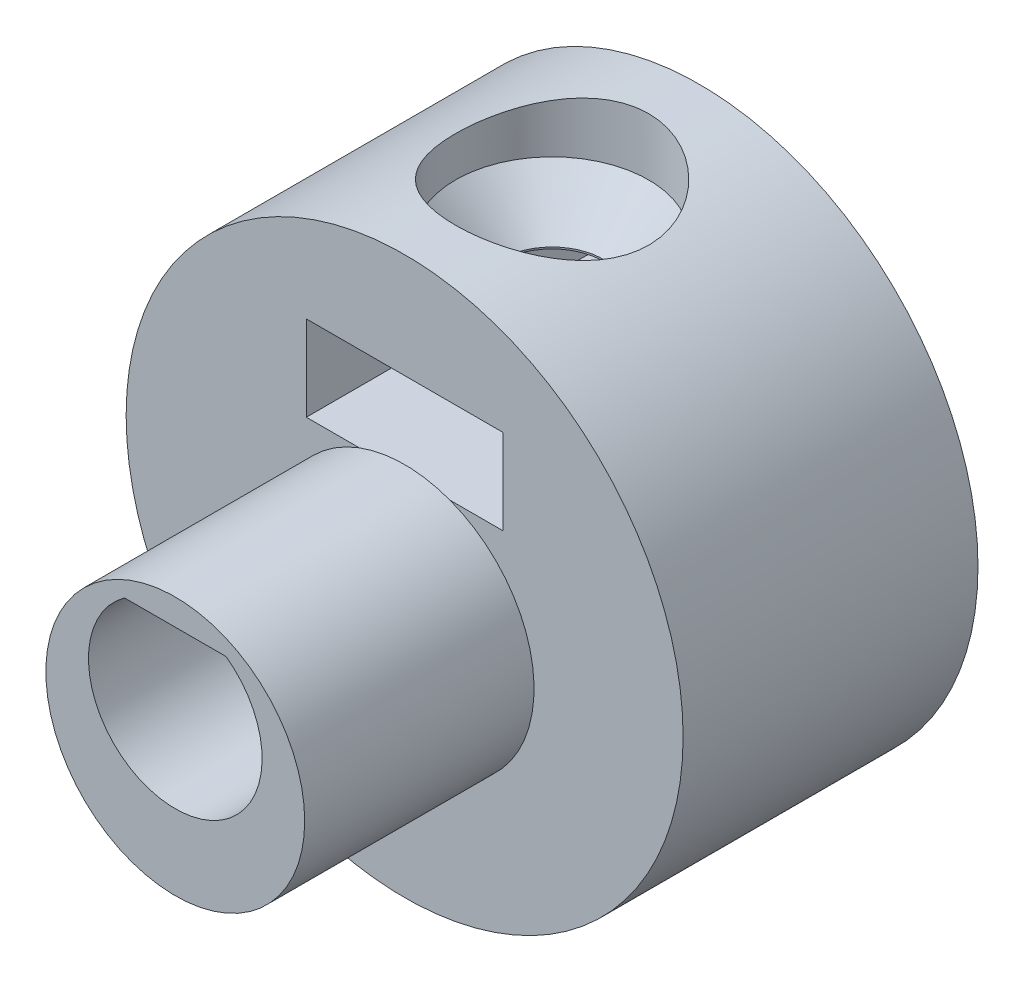
ISO-10303-21;
HEADER;
FILE_DESCRIPTION(('STEP AP214'),'2;1');
FILE_NAME('part.step','',(''),(''),'','','');
FILE_SCHEMA(('AUTOMOTIVE_DESIGN { 1 0 10303 214 1 1 1 1 }'));
ENDSEC;
DATA;
#1=APPLICATION_CONTEXT('core data for automotive mechanical design processes');
#2=APPLICATION_PROTOCOL_DEFINITION('international standard','automotive_design',2000,#1);
#3=PRODUCT_CONTEXT('',#1,'mechanical');
#4=PRODUCT('Part','Part','',(#3));
#5=PRODUCT_RELATED_PRODUCT_CATEGORY('part','',(#4));
#6=PRODUCT_DEFINITION_FORMATION('','',#4);
#7=PRODUCT_DEFINITION_CONTEXT('part definition',#1,'design');
#8=PRODUCT_DEFINITION('design','',#6,#7);
#9=PRODUCT_DEFINITION_SHAPE('','',#8);
#10=(LENGTH_UNIT() NAMED_UNIT(*) SI_UNIT(.MILLI.,.METRE.));
#11=(NAMED_UNIT(*) PLANE_ANGLE_UNIT() SI_UNIT($,.RADIAN.));
#12=(NAMED_UNIT(*) SI_UNIT($,.STERADIAN.) SOLID_ANGLE_UNIT());
#13=UNCERTAINTY_MEASURE_WITH_UNIT(LENGTH_MEASURE(1.E-05),#10,'distance_accuracy_value','');
#14=(GEOMETRIC_REPRESENTATION_CONTEXT(3) GLOBAL_UNCERTAINTY_ASSIGNED_CONTEXT((#13)) GLOBAL_UNIT_ASSIGNED_CONTEXT((#10,
#11,#12)) REPRESENTATION_CONTEXT('',''));
#15=CARTESIAN_POINT('',(0.,0.,0.));
#16=DIRECTION('',(0.,0.,1.));
#17=DIRECTION('',(1.,0.,0.));
#18=AXIS2_PLACEMENT_3D('',#15,#16,#17);
#19=CARTESIAN_POINT('',(0.,0.,9.));
#20=DIRECTION('',(0.,0.,-1.));
#21=DIRECTION('',(-1.,0.,0.));
#22=AXIS2_PLACEMENT_3D('',#19,#20,#21);
#23=CYLINDRICAL_SURFACE('',#22,8.5);
#24=CARTESIAN_POINT('',(0.,0.,9.));
#25=DIRECTION('',(0.,0.,1.));
#26=DIRECTION('',(1.,0.,0.));
#27=AXIS2_PLACEMENT_3D('',#24,#25,#26);
#28=CIRCLE('',#27,8.5);
#29=CARTESIAN_POINT('',(8.5,0.,9.));
#30=VERTEX_POINT('',#29);
#31=EDGE_CURVE('E272',#30,#30,#28,.T.);
#32=ORIENTED_EDGE('',*,*,#31,.F.);
#33=EDGE_LOOP('',(#32));
#34=FACE_BOUND('',#33,.T.);
#35=CARTESIAN_POINT('',(0.,0.,0.));
#36=DIRECTION('',(0.,0.,1.));
#37=DIRECTION('',(1.,0.,0.));
#38=AXIS2_PLACEMENT_3D('',#35,#36,#37);
#39=CIRCLE('',#38,8.5);
#40=CARTESIAN_POINT('',(8.5,0.,0.));
#41=VERTEX_POINT('',#40);
#42=EDGE_CURVE('E266',#41,#41,#39,.T.);
#43=ORIENTED_EDGE('',*,*,#42,.T.);
#44=EDGE_LOOP('',(#43));
#45=FACE_BOUND('',#44,.T.);
#46=CARTESIAN_POINT('',(-2.4976566133076,8.12475916209218,6.06978069869673));
#47=CARTESIAN_POINT('',(-2.45319115247166,8.13842624372445,6.14052214784692));
#48=CARTESIAN_POINT('',(-2.40579379129014,8.15259906685285,6.20926792787036));
#49=CARTESIAN_POINT('',(-2.30541918353997,8.18155142551015,6.34241791198123));
#50=CARTESIAN_POINT('',(-2.25244214730842,8.19633093815584,6.40682227957694));
#51=CARTESIAN_POINT('',(-2.08559993364935,8.24096387551114,6.59296340845329));
#52=CARTESIAN_POINT('',(-1.96379293821466,8.27112157248585,6.70767691704536));
#53=CARTESIAN_POINT('',(-1.70636003995567,8.32797463190604,6.91184711282402));
#54=CARTESIAN_POINT('',(-1.57128592838729,8.35474881482083,7.001981892767));
#55=CARTESIAN_POINT('',(-1.28750137103305,8.40315485018163,7.15915511575892));
#56=CARTESIAN_POINT('',(-1.13879895604352,8.42478970443847,7.22620705151039));
#57=CARTESIAN_POINT('',(-0.831187937836323,8.46068191069057,7.33519131239508));
#58=CARTESIAN_POINT('',(-0.672256571938539,8.47492212101672,7.37706530718806));
#59=CARTESIAN_POINT('',(-0.349104402202426,8.4943684291606,7.43385731899328));
#60=CARTESIAN_POINT('',(-0.184884583871303,8.49957620037078,7.44878032909372));
#61=CARTESIAN_POINT('',(0.138015723993133,8.50036011208845,7.45103621336103));
#62=CARTESIAN_POINT('',(0.296689734672785,8.4962657088658,7.43931282000832));
#63=CARTESIAN_POINT('',(0.609739891194811,8.47955195455849,7.39064304040091));
#64=CARTESIAN_POINT('',(0.764113634581695,8.46692793384153,7.35368283786199));
#65=CARTESIAN_POINT('',(1.06375533887611,8.4345186012922,7.25603150933245));
#66=CARTESIAN_POINT('',(1.20905000683216,8.41475557760322,7.19541419459285));
#67=CARTESIAN_POINT('',(1.48731375058839,8.37004774740902,7.0524065686952));
#68=CARTESIAN_POINT('',(1.62030956781964,8.34511458458429,6.97006507104002));
#69=CARTESIAN_POINT('',(1.77519124725063,8.31261821534849,6.85638504059988));
#70=CARTESIAN_POINT('',(1.8043222672237,8.30634083738567,6.83415379011479));
#71=CARTESIAN_POINT('',(1.96343933734412,8.27119610111673,6.70795471337644));
#72=CARTESIAN_POINT('',(2.08511950406867,8.24108270241644,6.59342954668651));
#73=CARTESIAN_POINT('',(2.30774596317545,8.1815459992705,6.34519120906915));
#74=CARTESIAN_POINT('',(2.40863639693148,8.15212473740542,6.2114279425932));
#75=CARTESIAN_POINT('',(2.58236776313032,8.09871823066431,5.93498995802956));
#76=CARTESIAN_POINT('',(2.65633004978303,8.07453878944837,5.79306002253414));
#77=CARTESIAN_POINT('',(2.7805092495441,8.03262664641585,5.49839769507062));
#78=CARTESIAN_POINT('',(2.83074936112863,8.01488765027596,5.34567602537025));
#79=CARTESIAN_POINT('',(2.90591996981457,7.98794413403531,5.03295557266693));
#80=CARTESIAN_POINT('',(2.9307875433104,7.97876083684202,4.87293972081594));
#81=CARTESIAN_POINT('',(2.95398174635075,7.97020434608399,4.55072336269741));
#82=CARTESIAN_POINT('',(2.95230970967962,7.97083065952385,4.38852296662646));
#83=CARTESIAN_POINT('',(2.92298994582522,7.98162544091318,4.07214390352963));
#84=CARTESIAN_POINT('',(2.89618320404268,7.9914849607523,3.91787537801917));
#85=CARTESIAN_POINT('',(2.81878881465332,8.01910824594589,3.61614548479724));
#86=CARTESIAN_POINT('',(2.76819372913322,8.03687448340477,3.46868626200185));
#87=CARTESIAN_POINT('',(2.64374182838853,8.07867559451911,3.18164089371048));
#88=CARTESIAN_POINT('',(2.56947203344734,8.10282034535183,3.04225083932772));
#89=CARTESIAN_POINT('',(2.4000811737298,8.15459461002143,2.77756977114323));
#90=CARTESIAN_POINT('',(2.30497218991926,8.18222210090779,2.65227065192168));
#91=CARTESIAN_POINT('',(2.14444672038787,8.22525010429297,2.47244158886466));
#92=CARTESIAN_POINT('',(2.08555070125962,8.24041673348502,2.41191270278541));
#93=CARTESIAN_POINT('',(1.96287977928872,8.27049513310864,2.29621000389169));
#94=CARTESIAN_POINT('',(1.89911464567286,8.28540734404793,2.24102594733433));
#95=CARTESIAN_POINT('',(1.83303027798234,8.3,2.18861513373476));
#96=B_SPLINE_CURVE_WITH_KNOTS('',3,(#46,#47,#48,#49,#50,#51,#52,#53,#54,#55,#56,#57,#58,#59,#60,
#61,#62,#63,#64,#65,#66,#67,#68,#69,#70,#71,#72,#73,#74,#75,#76,#77,#78,#79,#80,#81,#82,#83,#84,
#85,#86,#87,#88,#89,#90,#91,#92,#93,#94,#95),.UNSPECIFIED.,.F.,.F.,(4,2,2,2,2,2,2,2,2,2,2,2,2,2,
2,2,2,2,2,2,2,2,2,2,4),(0.,0.253833285787018,0.507657006239854,1.01513132403204,
1.50672343842426,1.99802771074242,2.49046585733757,2.98281276276087,3.4579950628208,
3.93343771763219,4.40740867898812,4.88032358222269,4.99186106409764,5.49853142231878,
6.00654586378571,6.48996962093975,6.9729196424049,7.45706448441352,7.94118499513888,
8.40966421544493,8.87829001289202,9.35558437726861,9.83260277159268,10.0897481621581,
10.3463905361852),.UNSPECIFIED.);
#97=CARTESIAN_POINT('',(-1.83303027798234,8.3,6.81138486626524));
#98=VERTEX_POINT('',#97);
#99=CARTESIAN_POINT('',(1.83303027798234,8.3,2.18861513373476));
#100=VERTEX_POINT('',#99);
#101=EDGE_CURVE('E187',#98,#100,#96,.T.);
#102=ORIENTED_EDGE('',*,*,#101,.F.);
#103=CARTESIAN_POINT('',(2.4976566133076,8.12475916209218,2.93021930130327));
#104=CARTESIAN_POINT('',(2.45318994500136,8.13842662563914,2.85947588226206));
#105=CARTESIAN_POINT('',(2.40579116119691,8.15259985847907,2.79072823574639));
#106=CARTESIAN_POINT('',(2.30541346555239,8.18155304169366,2.6575748509336));
#107=CARTESIAN_POINT('',(2.25243477065462,8.19633296846693,2.5931689439928));
#108=CARTESIAN_POINT('',(2.08559334134924,8.24096552582563,2.40703032681757));
#109=CARTESIAN_POINT('',(1.96378968996023,8.27112236826603,2.2923202912556));
#110=CARTESIAN_POINT('',(1.70636391719496,8.32797369967156,2.08815617097751));
#111=CARTESIAN_POINT('',(1.57129368992825,8.35474701933418,1.99802391634974));
#112=CARTESIAN_POINT('',(1.28751241618149,8.40315343701242,1.84084949313752));
#113=CARTESIAN_POINT('',(1.1388084928932,8.42478919827129,1.77379535302194));
#114=CARTESIAN_POINT('',(0.827987048637116,8.4610547714335,1.66367563352059));
#115=CARTESIAN_POINT('',(0.665639156561353,8.47551136360076,1.62119941997594));
#116=CARTESIAN_POINT('',(0.335522235240602,8.49498290962041,1.56436373105513));
#117=CARTESIAN_POINT('',(0.167753698153421,8.4999987181954,1.55000171035212));
#118=CARTESIAN_POINT('',(-0.160573090672336,8.50000122693764,1.54999836285859));
#119=CARTESIAN_POINT('',(-0.321132585567959,8.49540802765908,1.56315397651474));
#120=CARTESIAN_POINT('',(-0.637504919535551,8.47754145494676,1.61524709054499));
#121=CARTESIAN_POINT('',(-0.793317230736235,8.46426711985929,1.65418744723262));
#122=CARTESIAN_POINT('',(-1.10584501784713,8.42931993487434,1.75982174433415));
#123=CARTESIAN_POINT('',(-1.26194403527556,8.40715150324722,1.82817474439963));
#124=CARTESIAN_POINT('',(-1.55944141682563,8.35708973169379,1.99014752011679));
#125=CARTESIAN_POINT('',(-1.70083313076283,8.32919381878685,2.08377865754721));
#126=CARTESIAN_POINT('',(-1.96376574109255,8.27112897290653,2.29229244866549));
#127=CARTESIAN_POINT('',(-2.08550883931445,8.24098858276189,2.40692868073665));
#128=CARTESIAN_POINT('',(-2.30800118973862,8.1814676773007,2.65516964079898));
#129=CARTESIAN_POINT('',(-2.40875542862292,8.15208698294651,2.78876985048177));
#130=CARTESIAN_POINT('',(-2.58234889509949,8.09872513889258,3.06497202468677));
#131=CARTESIAN_POINT('',(-2.65628388776906,8.07455420965996,3.20684835983295));
#132=CARTESIAN_POINT('',(-2.78047378166719,8.03263878107992,3.50150025801988));
#133=CARTESIAN_POINT('',(-2.83073638027927,8.01489219321013,3.65427225956399));
#134=CARTESIAN_POINT('',(-2.90592304531664,7.98794314173254,3.96705492968833));
#135=CARTESIAN_POINT('',(-2.9307908841645,7.97875964189572,4.12708084544346));
#136=CARTESIAN_POINT('',(-2.95398136626459,7.9702044484857,4.44929719503748));
#137=CARTESIAN_POINT('',(-2.95230871741702,7.9708310147478,4.61148723989113));
#138=CARTESIAN_POINT('',(-2.92299011430598,7.98162538865863,4.92785476293909));
#139=CARTESIAN_POINT('',(-2.89618368313548,7.99148478657943,5.08212194506856));
#140=CARTESIAN_POINT('',(-2.81878968112678,8.01910794001413,5.38385194667557));
#141=CARTESIAN_POINT('',(-2.76819426046636,8.03687430454259,5.53131250247069));
#142=CARTESIAN_POINT('',(-2.6437418358828,8.07867559240639,5.81835909920957));
#143=CARTESIAN_POINT('',(-2.56947204541021,8.10282034150987,5.95774914059871));
#144=CARTESIAN_POINT('',(-2.40008118744198,8.1545946059138,6.22243020880838));
#145=CARTESIAN_POINT('',(-2.30497219775281,8.18222209879261,6.34772933892776));
#146=CARTESIAN_POINT('',(-2.14444664458044,8.22525012462106,6.52755849626095));
#147=CARTESIAN_POINT('',(-2.08555054227539,8.24041677442083,6.58808746070075));
#148=CARTESIAN_POINT('',(-1.96287960668323,8.27049517345836,6.70379014541685));
#149=CARTESIAN_POINT('',(-1.89911455609382,8.28540736381247,6.75897412356356));
#150=CARTESIAN_POINT('',(-1.83303027798234,8.3,6.81138486626524));
#151=B_SPLINE_CURVE_WITH_KNOTS('',3,(#103,#104,#105,#106,#107,#108,#109,#110,#111,#112,#113,
#114,#115,#116,#117,#118,#119,#120,#121,#122,#123,#124,#125,#126,#127,#128,#129,#130,#131,#132,
#133,#134,#135,#136,#137,#138,#139,#140,#141,#142,#143,#144,#145,#146,#147,#148,#149,#150),
.UNSPECIFIED.,.F.,.F.,(4,2,2,2,2,2,2,2,2,2,2,2,2,2,2,2,2,2,2,2,2,2,2,4),(0.,0.253840367119801,
0.507670868777879,1.01513136017837,1.50670724536165,1.99802774497997,2.50068775902432,
3.00330226248912,3.48440262049298,3.96555628146755,4.47840114630792,4.99147690469338,
5.49887966106123,6.00616172724637,6.48942722983445,6.97253548375081,7.45671110324845,
7.94080083792565,8.40927599969572,8.87790585615661,9.35520018446692,9.83221861486184,
10.0893643522644,10.3460063794543),.UNSPECIFIED.);
#152=EDGE_CURVE('E194',#100,#98,#151,.T.);
#153=ORIENTED_EDGE('',*,*,#152,.F.);
#154=EDGE_LOOP('',(#102,#153));
#155=FACE_BOUND('',#154,.T.);
#156=ADVANCED_FACE('F37',(#34,#45,#155),#23,.T.);
#157=CARTESIAN_POINT('',(0.,2.7,4.5));
#158=DIRECTION('',(0.,-1.,0.));
#159=DIRECTION('',(0.,0.,1.));
#160=AXIS2_PLACEMENT_3D('',#157,#158,#159);
#161=CONICAL_SURFACE('',#160,1.6,0.0174532925199433);
#162=CARTESIAN_POINT('',(0.,5.35146683778934,4.5));
#163=DIRECTION('',(0.,1.,0.));
#164=DIRECTION('',(0.,0.,1.));
#165=AXIS2_PLACEMENT_3D('',#162,#163,#164);
#166=CIRCLE('',#165,1.55371847419137);
#167=CARTESIAN_POINT('',(0.,5.35146683778934,6.05371847419137));
#168=VERTEX_POINT('',#167);
#169=EDGE_CURVE('E199',#168,#168,#166,.T.);
#170=ORIENTED_EDGE('',*,*,#169,.T.);
#171=EDGE_LOOP('',(#170));
#172=FACE_BOUND('',#171,.T.);
#173=CARTESIAN_POINT('',(0.,5.3,4.5));
#174=DIRECTION('',(0.,1.,0.));
#175=DIRECTION('',(0.,0.,1.));
#176=AXIS2_PLACEMENT_3D('',#173,#174,#175);
#177=CIRCLE('',#176,1.55461683118663);
#178=CARTESIAN_POINT('',(0.,5.3,6.05461683118663));
#179=VERTEX_POINT('',#178);
#180=EDGE_CURVE('E255',#179,#179,#177,.T.);
#181=ORIENTED_EDGE('',*,*,#180,.F.);
#182=EDGE_LOOP('',(#181));
#183=FACE_BOUND('',#182,.T.);
#184=ADVANCED_FACE('F184',(#172,#183),#161,.F.);
#185=CARTESIAN_POINT('',(0.,0.,9.));
#186=DIRECTION('',(0.,0.,1.));
#187=DIRECTION('',(1.,0.,0.));
#188=AXIS2_PLACEMENT_3D('',#185,#186,#187);
#189=PLANE('',#188);
#190=CARTESIAN_POINT('',(0.,-1.,9.));
#191=DIRECTION('',(0.,0.,1.));
#192=DIRECTION('',(1.,0.,0.));
#193=AXIS2_PLACEMENT_3D('',#190,#191,#192);
#194=CIRCLE('',#193,3.95);
#195=CARTESIAN_POINT('',(-1.38293166859393,2.7,9.));
#196=VERTEX_POINT('',#195);
#197=CARTESIAN_POINT('',(1.38293166859393,2.7,9.));
#198=VERTEX_POINT('',#197);
#199=EDGE_CURVE('E11',#196,#198,#194,.T.);
#200=ORIENTED_EDGE('',*,*,#199,.F.);
#201=DIRECTION('',(-1.,0.,0.));
#202=VECTOR('',#201,1.);
#203=CARTESIAN_POINT('',(3.,2.7,9.));
#204=LINE('',#203,#202);
#205=CARTESIAN_POINT('',(-3.,2.7,9.));
#206=VERTEX_POINT('',#205);
#207=EDGE_CURVE('E410',#196,#206,#204,.T.);
#208=ORIENTED_EDGE('',*,*,#207,.T.);
#209=DIRECTION('',(0.,1.,0.));
#210=VECTOR('',#209,1.);
#211=CARTESIAN_POINT('',(-3.,2.7,9.));
#212=LINE('',#211,#210);
#213=CARTESIAN_POINT('',(-3.,5.3,9.));
#214=VERTEX_POINT('',#213);
#215=EDGE_CURVE('E246',#206,#214,#212,.T.);
#216=ORIENTED_EDGE('',*,*,#215,.T.);
#217=DIRECTION('',(1.,0.,0.));
#218=VECTOR('',#217,1.);
#219=CARTESIAN_POINT('',(3.,5.3,9.));
#220=LINE('',#219,#218);
#221=CARTESIAN_POINT('',(3.,5.3,9.));
#222=VERTEX_POINT('',#221);
#223=EDGE_CURVE('E406',#214,#222,#220,.T.);
#224=ORIENTED_EDGE('',*,*,#223,.T.);
#225=DIRECTION('',(0.,-1.,0.));
#226=VECTOR('',#225,1.);
#227=CARTESIAN_POINT('',(3.,2.7,9.));
#228=LINE('',#227,#226);
#229=CARTESIAN_POINT('',(3.,2.7,9.));
#230=VERTEX_POINT('',#229);
#231=EDGE_CURVE('E408',#222,#230,#228,.T.);
#232=ORIENTED_EDGE('',*,*,#231,.T.);
#233=EDGE_CURVE('E261',#230,#198,#204,.T.);
#234=ORIENTED_EDGE('',*,*,#233,.T.);
#235=EDGE_LOOP('',(#200,#208,#216,#224,#232,#234));
#236=FACE_BOUND('',#235,.T.);
#237=ORIENTED_EDGE('',*,*,#31,.T.);
#238=EDGE_LOOP('',(#237));
#239=FACE_BOUND('',#238,.T.);
#240=ADVANCED_FACE('F209',(#236,#239),#189,.T.);
#241=CARTESIAN_POINT('',(0.,0.,0.));
#242=DIRECTION('',(0.,0.,1.));
#243=DIRECTION('',(1.,0.,0.));
#244=AXIS2_PLACEMENT_3D('',#241,#242,#243);
#245=PLANE('',#244);
#246=DIRECTION('',(1.,0.,0.));
#247=VECTOR('',#246,1.);
#248=CARTESIAN_POINT('',(1.54919333848297,2.15,0.));
#249=LINE('',#248,#247);
#250=CARTESIAN_POINT('',(-1.54919333848297,2.15,0.));
#251=VERTEX_POINT('',#250);
#252=CARTESIAN_POINT('',(1.54919333848297,2.15,0.));
#253=VERTEX_POINT('',#252);
#254=EDGE_CURVE('E137',#251,#253,#249,.T.);
#255=ORIENTED_EDGE('',*,*,#254,.F.);
#256=CARTESIAN_POINT('',(0.,0.,0.));
#257=DIRECTION('',(0.,0.,-1.));
#258=DIRECTION('',(-1.,0.,0.));
#259=AXIS2_PLACEMENT_3D('',#256,#257,#258);
#260=CIRCLE('',#259,2.65);
#261=EDGE_CURVE('E55',#253,#251,#260,.T.);
#262=ORIENTED_EDGE('',*,*,#261,.F.);
#263=EDGE_LOOP('',(#255,#262));
#264=FACE_BOUND('',#263,.T.);
#265=DIRECTION('',(1.,0.,0.));
#266=VECTOR('',#265,1.);
#267=CARTESIAN_POINT('',(3.,5.3,0.));
#268=LINE('',#267,#266);
#269=CARTESIAN_POINT('',(-3.,5.3,0.));
#270=VERTEX_POINT('',#269);
#271=CARTESIAN_POINT('',(3.,5.3,0.));
#272=VERTEX_POINT('',#271);
#273=EDGE_CURVE('E253',#270,#272,#268,.T.);
#274=ORIENTED_EDGE('',*,*,#273,.F.);
#275=DIRECTION('',(0.,1.,0.));
#276=VECTOR('',#275,1.);
#277=CARTESIAN_POINT('',(-3.,2.7,0.));
#278=LINE('',#277,#276);
#279=CARTESIAN_POINT('',(-3.,2.7,0.));
#280=VERTEX_POINT('',#279);
#281=EDGE_CURVE('E250',#280,#270,#278,.T.);
#282=ORIENTED_EDGE('',*,*,#281,.F.);
#283=DIRECTION('',(-1.,0.,0.));
#284=VECTOR('',#283,1.);
#285=CARTESIAN_POINT('',(3.,2.7,0.));
#286=LINE('',#285,#284);
#287=CARTESIAN_POINT('',(3.,2.7,0.));
#288=VERTEX_POINT('',#287);
#289=EDGE_CURVE('E236',#288,#280,#286,.T.);
#290=ORIENTED_EDGE('',*,*,#289,.F.);
#291=DIRECTION('',(0.,-1.,0.));
#292=VECTOR('',#291,1.);
#293=CARTESIAN_POINT('',(3.,2.7,0.));
#294=LINE('',#293,#292);
#295=EDGE_CURVE('E247',#272,#288,#294,.T.);
#296=ORIENTED_EDGE('',*,*,#295,.F.);
#297=EDGE_LOOP('',(#274,#282,#290,#296));
#298=FACE_BOUND('',#297,.T.);
#299=ORIENTED_EDGE('',*,*,#42,.F.);
#300=EDGE_LOOP('',(#299));
#301=FACE_BOUND('',#300,.T.);
#302=ADVANCED_FACE('F204',(#264,#298,#301),#245,.F.);
#303=CARTESIAN_POINT('',(-3.,2.7,9.));
#304=DIRECTION('',(-1.,0.,0.));
#305=DIRECTION('',(0.,0.,1.));
#306=AXIS2_PLACEMENT_3D('',#303,#304,#305);
#307=PLANE('',#306);
#308=ORIENTED_EDGE('',*,*,#281,.T.);
#309=DIRECTION('',(0.,0.,-1.));
#310=VECTOR('',#309,1.);
#311=CARTESIAN_POINT('',(-3.,5.3,9.));
#312=LINE('',#311,#310);
#313=EDGE_CURVE('E270',#214,#270,#312,.T.);
#314=ORIENTED_EDGE('',*,*,#313,.F.);
#315=ORIENTED_EDGE('',*,*,#215,.F.);
#316=DIRECTION('',(0.,0.,-1.));
#317=VECTOR('',#316,1.);
#318=CARTESIAN_POINT('',(-3.,2.7,9.));
#319=LINE('',#318,#317);
#320=EDGE_CURVE('E239',#206,#280,#319,.T.);
#321=ORIENTED_EDGE('',*,*,#320,.T.);
#322=EDGE_LOOP('',(#308,#314,#315,#321));
#323=FACE_BOUND('',#322,.T.);
#324=ADVANCED_FACE('F208',(#323),#307,.F.);
#325=CARTESIAN_POINT('',(3.,2.7,9.));
#326=DIRECTION('',(0.,-1.,0.));
#327=DIRECTION('',(0.,0.,-1.));
#328=AXIS2_PLACEMENT_3D('',#325,#326,#327);
#329=PLANE('',#328);
#330=CARTESIAN_POINT('',(0.,2.7,4.5));
#331=DIRECTION('',(0.,1.,0.));
#332=DIRECTION('',(0.,0.,1.));
#333=AXIS2_PLACEMENT_3D('',#330,#331,#332);
#334=CIRCLE('',#333,1.6);
#335=CARTESIAN_POINT('',(0.,2.7,6.1));
#336=VERTEX_POINT('',#335);
#337=EDGE_CURVE('E232',#336,#336,#334,.T.);
#338=ORIENTED_EDGE('',*,*,#337,.F.);
#339=EDGE_LOOP('',(#338));
#340=FACE_BOUND('',#339,.T.);
#341=ORIENTED_EDGE('',*,*,#289,.T.);
#342=ORIENTED_EDGE('',*,*,#320,.F.);
#343=ORIENTED_EDGE('',*,*,#207,.F.);
#344=EDGE_CURVE('E411',#198,#196,#204,.T.);
#345=ORIENTED_EDGE('',*,*,#344,.F.);
#346=ORIENTED_EDGE('',*,*,#233,.F.);
#347=DIRECTION('',(0.,0.,-1.));
#348=VECTOR('',#347,1.);
#349=CARTESIAN_POINT('',(3.,2.7,9.));
#350=LINE('',#349,#348);
#351=EDGE_CURVE('E242',#230,#288,#350,.T.);
#352=ORIENTED_EDGE('',*,*,#351,.T.);
#353=EDGE_LOOP('',(#341,#342,#343,#345,#346,#352));
#354=FACE_BOUND('',#353,.T.);
#355=ADVANCED_FACE('F216',(#340,#354),#329,.F.);
#356=CARTESIAN_POINT('',(3.,2.7,9.));
#357=DIRECTION('',(1.,0.,0.));
#358=DIRECTION('',(0.,0.,-1.));
#359=AXIS2_PLACEMENT_3D('',#356,#357,#358);
#360=PLANE('',#359);
#361=ORIENTED_EDGE('',*,*,#295,.T.);
#362=ORIENTED_EDGE('',*,*,#351,.F.);
#363=ORIENTED_EDGE('',*,*,#231,.F.);
#364=DIRECTION('',(0.,0.,-1.));
#365=VECTOR('',#364,1.);
#366=CARTESIAN_POINT('',(3.,5.3,9.));
#367=LINE('',#366,#365);
#368=EDGE_CURVE('E268',#222,#272,#367,.T.);
#369=ORIENTED_EDGE('',*,*,#368,.T.);
#370=EDGE_LOOP('',(#361,#362,#363,#369));
#371=FACE_BOUND('',#370,.T.);
#372=ADVANCED_FACE('F221',(#371),#360,.F.);
#373=CARTESIAN_POINT('',(3.,5.3,9.));
#374=DIRECTION('',(0.,1.,0.));
#375=DIRECTION('',(0.,0.,1.));
#376=AXIS2_PLACEMENT_3D('',#373,#374,#375);
#377=PLANE('',#376);
#378=ORIENTED_EDGE('',*,*,#180,.T.);
#379=EDGE_LOOP('',(#378));
#380=FACE_BOUND('',#379,.T.);
#381=ORIENTED_EDGE('',*,*,#273,.T.);
#382=ORIENTED_EDGE('',*,*,#368,.F.);
#383=ORIENTED_EDGE('',*,*,#223,.F.);
#384=ORIENTED_EDGE('',*,*,#313,.T.);
#385=EDGE_LOOP('',(#381,#382,#383,#384));
#386=FACE_BOUND('',#385,.T.);
#387=ADVANCED_FACE('F218',(#380,#386),#377,.F.);
#388=CARTESIAN_POINT('',(0.,2.7,4.5));
#389=DIRECTION('',(0.,1.,0.));
#390=DIRECTION('',(0.,0.,1.));
#391=AXIS2_PLACEMENT_3D('',#388,#389,#390);
#392=CONICAL_SURFACE('',#391,1.6,0.0174532925199433);
#393=CARTESIAN_POINT('',(-1.00549557480747,2.45183169264177,5.73900592127049));
#394=CARTESIAN_POINT('',(-1.04114906063982,2.43721135745625,5.70973492411046));
#395=CARTESIAN_POINT('',(-1.07542625410772,2.42224402908244,5.67901298512249));
#396=CARTESIAN_POINT('',(-1.14113413618689,2.3919911165622,5.61478896234473));
#397=CARTESIAN_POINT('',(-1.17256416605369,2.37670545976558,5.58128623858694));
#398=CARTESIAN_POINT('',(-1.26270371489511,2.33080024736449,5.47647961952857));
#399=CARTESIAN_POINT('',(-1.3169213793621,2.30027878291521,5.40115812157085));
#400=CARTESIAN_POINT('',(-1.40629379304243,2.24660375824557,5.25085287167676));
#401=CARTESIAN_POINT('',(-1.44295733493256,2.22300554787248,5.17691904176447));
#402=CARTESIAN_POINT('',(-1.50480606414261,2.18161599156685,5.02299630739797));
#403=CARTESIAN_POINT('',(-1.53002196404735,2.16380914501963,4.94302428393103));
#404=CARTESIAN_POINT('',(-1.56538722996714,2.13833561803012,4.78928784099944));
#405=CARTESIAN_POINT('',(-1.57705374091451,2.12966159914898,4.7160420403303));
#406=CARTESIAN_POINT('',(-1.59014005884272,2.11991289887216,4.56815841155053));
#407=CARTESIAN_POINT('',(-1.59157084202674,2.11883007714015,4.49352216064572));
#408=CARTESIAN_POINT('',(-1.58548333059455,2.12337948339012,4.37193606875479));
#409=CARTESIAN_POINT('',(-1.58100764763395,2.12672985034913,4.32471299614241));
#410=CARTESIAN_POINT('',(-1.56798037685201,2.13635288799468,4.23114685616058));
#411=CARTESIAN_POINT('',(-1.55942919035661,2.14262527094097,4.18480370261023));
#412=CARTESIAN_POINT('',(-1.52879158791388,2.16469903940939,4.05164292920928));
#413=CARTESIAN_POINT('',(-1.50147787835819,2.18396975180046,3.96655242033379));
#414=CARTESIAN_POINT('',(-1.43395728016035,2.228877436446,3.80330921314797));
#415=CARTESIAN_POINT('',(-1.39370771912562,2.25453541476779,3.72518058550496));
#416=CARTESIAN_POINT('',(-1.30194872073587,2.30873494744538,3.57771103157382));
#417=CARTESIAN_POINT('',(-1.25050699034981,2.33725863013626,3.50832106290542));
#418=CARTESIAN_POINT('',(-1.13729649217,2.39437899722569,3.37889254633403));
#419=CARTESIAN_POINT('',(-1.07555521978666,2.42297529276594,3.31882990155459));
#420=CARTESIAN_POINT('',(-0.973645329723348,2.46495538640708,3.23468821152848));
#421=CARTESIAN_POINT('',(-0.936852338139143,2.47921167114098,3.20689545209238));
#422=CARTESIAN_POINT('',(-0.898791632785118,2.49292470821633,3.18067432943348));
#423=B_SPLINE_CURVE_WITH_KNOTS('',3,(#393,#394,#395,#396,#397,#398,#399,#400,#401,#402,#403,
#404,#405,#406,#407,#408,#409,#410,#411,#412,#413,#414,#415,#416,#417,#418,#419,#420,#421,#422),
.UNSPECIFIED.,.F.,.F.,(4,2,2,2,2,2,2,2,2,2,2,2,2,2,4),(0.,0.145071479904694,0.290176439531788,
0.58176670798087,0.838270578911275,1.09408215532818,1.31709735954096,1.53987337923491,
1.68227071544396,1.82465403229528,2.09719464809532,2.37064370291009,2.6424823768656,
2.91360664134894,3.05822890437435),.UNSPECIFIED.);
#424=CARTESIAN_POINT('',(-1.54919333848297,2.15,4.85968215303523));
#425=VERTEX_POINT('',#424);
#426=CARTESIAN_POINT('',(-1.54919333848297,2.15,4.14031784696477));
#427=VERTEX_POINT('',#426);
#428=EDGE_CURVE('E124',#425,#427,#423,.T.);
#429=ORIENTED_EDGE('',*,*,#428,.T.);
#430=CARTESIAN_POINT('',(0.,2.15,4.5));
#431=DIRECTION('',(0.,1.,0.));
#432=DIRECTION('',(0.,0.,1.));
#433=AXIS2_PLACEMENT_3D('',#430,#431,#432);
#434=CIRCLE('',#433,1.59039971428948);
#435=CARTESIAN_POINT('',(1.54919333848297,2.15,4.14031784696477));
#436=VERTEX_POINT('',#435);
#437=EDGE_CURVE('E146',#427,#436,#434,.F.);
#438=ORIENTED_EDGE('',*,*,#437,.T.);
#439=CARTESIAN_POINT('',(0.898791632785026,2.49292470821636,3.18067432943361));
#440=CARTESIAN_POINT('',(0.936667174091869,2.47927051213931,3.20677179469448));
#441=CARTESIAN_POINT('',(0.973259453225839,2.46510033526094,3.23439898301896));
#442=CARTESIAN_POINT('',(1.04376767374676,2.43608335542143,3.29255564674331));
#443=CARTESIAN_POINT('',(1.0776838577636,2.42123661399444,3.32308485847476));
#444=CARTESIAN_POINT('',(1.17557016100806,2.37606906609189,3.41909811560865));
#445=CARTESIAN_POINT('',(1.23531890598578,2.34525629207016,3.4887590093276));
#446=CARTESIAN_POINT('',(1.33688746965532,2.28872592187343,3.63016587750862));
#447=CARTESIAN_POINT('',(1.37991409141054,2.26280912711402,3.70097533368797));
#448=CARTESIAN_POINT('',(1.45482090488903,2.21539112527075,3.84934873596978));
#449=CARTESIAN_POINT('',(1.48675047057393,2.19387053930524,3.92688079366915));
#450=CARTESIAN_POINT('',(1.52649078444639,2.16624330525176,4.05036293822033));
#451=CARTESIAN_POINT('',(1.53863568873332,2.15760350544296,4.09440326356597));
#452=CARTESIAN_POINT('',(1.56535931442556,2.13835763176975,4.21061831708121));
#453=CARTESIAN_POINT('',(1.57703147188091,2.12967844576872,4.28382997857632));
#454=CARTESIAN_POINT('',(1.59014126030158,2.11991175720869,4.43173189427637));
#455=CARTESIAN_POINT('',(1.59157347829999,2.11882826984196,4.5064229095725));
#456=CARTESIAN_POINT('',(1.58548214395148,2.12338026611942,4.6280890862294));
#457=CARTESIAN_POINT('',(1.58100449371541,2.12673176428264,4.6753374605698));
#458=CARTESIAN_POINT('',(1.56796810410584,2.13636236712984,4.7689134900266));
#459=CARTESIAN_POINT('',(1.55941459571286,2.1426377190938,4.8152422462226));
#460=CARTESIAN_POINT('',(1.54094020654753,2.1559447387288,4.89556858875685));
#461=CARTESIAN_POINT('',(1.53184205614671,2.16243213657927,4.92985371489501));
#462=CARTESIAN_POINT('',(1.50043301899892,2.1844626040306,5.03423185275902));
#463=CARTESIAN_POINT('',(1.47449693940168,2.20219390749595,5.10281478191649));
#464=CARTESIAN_POINT('',(1.41400483611516,2.24151597205148,5.23509657756863));
#465=CARTESIAN_POINT('',(1.37941774580058,2.26312056153268,5.29877673587794));
#466=CARTESIAN_POINT('',(1.29526821667221,2.3124797150711,5.43164032556896));
#467=CARTESIAN_POINT('',(1.24412065574424,2.34063391387645,5.49967528139335));
#468=CARTESIAN_POINT('',(1.13196937923128,2.39689663997294,5.62643012728681));
#469=CARTESIAN_POINT('',(1.07101505130892,2.42500471808072,5.68519391445854));
#470=CARTESIAN_POINT('',(1.00549557480747,2.45183169264177,5.73900592127049));
#471=B_SPLINE_CURVE_WITH_KNOTS('',3,(#439,#440,#441,#442,#443,#444,#445,#446,#447,#448,#449,
#450,#451,#452,#453,#454,#455,#456,#457,#458,#459,#460,#461,#462,#463,#464,#465,#466,#467,#468,
#469,#470),.UNSPECIFIED.,.F.,.F.,(4,2,2,2,2,2,2,2,2,2,2,2,2,2,2,4),(0.,0.14383300457038,
0.287652953408443,0.576648544720373,0.836182761295904,1.09454699171719,1.23385804067958,
1.45669474324779,1.67964923152966,1.82213074054759,1.96442987844758,2.07252839770362,
2.29791473700063,2.52412238271167,2.7920167906323,3.05860202213607),.UNSPECIFIED.);
#472=CARTESIAN_POINT('',(1.54919333848297,2.15,4.85968215303523));
#473=VERTEX_POINT('',#472);
#474=EDGE_CURVE('E154',#436,#473,#471,.T.);
#475=ORIENTED_EDGE('',*,*,#474,.T.);
#476=EDGE_CURVE('E143',#473,#425,#434,.F.);
#477=ORIENTED_EDGE('',*,*,#476,.T.);
#478=EDGE_LOOP('',(#429,#438,#475,#477));
#479=FACE_BOUND('',#478,.T.);
#480=ORIENTED_EDGE('',*,*,#337,.T.);
#481=EDGE_LOOP('',(#480));
#482=FACE_BOUND('',#481,.T.);
#483=ADVANCED_FACE('F160',(#479,#482),#392,.F.);
#484=CARTESIAN_POINT('',(0.,8.5,4.5));
#485=DIRECTION('',(0.,-1.,0.));
#486=DIRECTION('',(0.,0.,-1.));
#487=AXIS2_PLACEMENT_3D('',#484,#485,#486);
#488=CYLINDRICAL_SURFACE('',#487,2.95);
#489=ORIENTED_EDGE('',*,*,#101,.T.);
#490=ORIENTED_EDGE('',*,*,#152,.T.);
#491=EDGE_LOOP('',(#489,#490));
#492=FACE_BOUND('',#491,.T.);
#493=CARTESIAN_POINT('',(0.,6.74774836359798,4.5));
#494=DIRECTION('',(0.,1.,0.));
#495=DIRECTION('',(0.,0.,1.));
#496=AXIS2_PLACEMENT_3D('',#493,#494,#495);
#497=CIRCLE('',#496,2.95);
#498=CARTESIAN_POINT('',(0.,6.74774836359798,7.45));
#499=VERTEX_POINT('',#498);
#500=EDGE_CURVE('E42',#499,#499,#497,.F.);
#501=ORIENTED_EDGE('',*,*,#500,.T.);
#502=EDGE_LOOP('',(#501));
#503=FACE_BOUND('',#502,.T.);
#504=ADVANCED_FACE('F180',(#492,#503),#488,.F.);
#505=CARTESIAN_POINT('',(0.,5.35146683778934,4.5));
#506=DIRECTION('',(0.,1.,0.));
#507=DIRECTION('',(0.,0.,1.));
#508=AXIS2_PLACEMENT_3D('',#505,#506,#507);
#509=CONICAL_SURFACE('',#508,1.55371847419137,0.785398163397443);
#510=ORIENTED_EDGE('',*,*,#500,.F.);
#511=EDGE_LOOP('',(#510));
#512=FACE_BOUND('',#511,.T.);
#513=ORIENTED_EDGE('',*,*,#169,.F.);
#514=EDGE_LOOP('',(#513));
#515=FACE_BOUND('',#514,.T.);
#516=ADVANCED_FACE('F40',(#512,#515),#509,.F.);
#517=CARTESIAN_POINT('',(0.,-1.,9.));
#518=DIRECTION('',(0.,0.,1.));
#519=DIRECTION('',(1.,0.,0.));
#520=AXIS2_PLACEMENT_3D('',#517,#518,#519);
#521=PLANE('',#520);
#522=EDGE_CURVE('E48',#198,#196,#194,.T.);
#523=ORIENTED_EDGE('',*,*,#522,.F.);
#524=ORIENTED_EDGE('',*,*,#344,.T.);
#525=EDGE_LOOP('',(#523,#524));
#526=FACE_BOUND('',#525,.T.);
#527=ADVANCED_FACE('F173',(#526),#521,.F.);
#528=CARTESIAN_POINT('',(0.,-1.,16.));
#529=DIRECTION('',(0.,0.,-1.));
#530=DIRECTION('',(-1.,0.,0.));
#531=AXIS2_PLACEMENT_3D('',#528,#529,#530);
#532=CYLINDRICAL_SURFACE('',#531,3.95);
#533=CARTESIAN_POINT('',(0.,-1.,16.));
#534=DIRECTION('',(0.,0.,1.));
#535=DIRECTION('',(1.,0.,0.));
#536=AXIS2_PLACEMENT_3D('',#533,#534,#535);
#537=CIRCLE('',#536,3.95);
#538=CARTESIAN_POINT('',(3.95,-1.,16.));
#539=VERTEX_POINT('',#538);
#540=EDGE_CURVE('E400',#539,#539,#537,.T.);
#541=ORIENTED_EDGE('',*,*,#540,.F.);
#542=EDGE_LOOP('',(#541));
#543=FACE_BOUND('',#542,.T.);
#544=ORIENTED_EDGE('',*,*,#522,.T.);
#545=ORIENTED_EDGE('',*,*,#199,.T.);
#546=EDGE_LOOP('',(#544,#545));
#547=FACE_BOUND('',#546,.T.);
#548=ADVANCED_FACE('F172',(#543,#547),#532,.T.);
#549=CARTESIAN_POINT('',(0.,-1.,16.));
#550=DIRECTION('',(0.,0.,1.));
#551=DIRECTION('',(1.,0.,0.));
#552=AXIS2_PLACEMENT_3D('',#549,#550,#551);
#553=PLANE('',#552);
#554=CARTESIAN_POINT('',(0.,0.,16.));
#555=DIRECTION('',(0.,0.,-1.));
#556=DIRECTION('',(-1.,0.,0.));
#557=AXIS2_PLACEMENT_3D('',#554,#555,#556);
#558=CIRCLE('',#557,2.65);
#559=CARTESIAN_POINT('',(1.54919333848297,2.15,16.));
#560=VERTEX_POINT('',#559);
#561=CARTESIAN_POINT('',(-1.54919333848297,2.15,16.));
#562=VERTEX_POINT('',#561);
#563=EDGE_CURVE('E121',#560,#562,#558,.T.);
#564=ORIENTED_EDGE('',*,*,#563,.T.);
#565=DIRECTION('',(1.,0.,0.));
#566=VECTOR('',#565,1.);
#567=CARTESIAN_POINT('',(1.54919333848297,2.15,16.));
#568=LINE('',#567,#566);
#569=EDGE_CURVE('E130',#562,#560,#568,.T.);
#570=ORIENTED_EDGE('',*,*,#569,.T.);
#571=EDGE_LOOP('',(#564,#570));
#572=FACE_BOUND('',#571,.T.);
#573=ORIENTED_EDGE('',*,*,#540,.T.);
#574=EDGE_LOOP('',(#573));
#575=FACE_BOUND('',#574,.T.);
#576=ADVANCED_FACE('F135',(#572,#575),#553,.T.);
#577=CARTESIAN_POINT('',(0.,0.,16.));
#578=DIRECTION('',(0.,0.,-1.));
#579=DIRECTION('',(-1.,0.,0.));
#580=AXIS2_PLACEMENT_3D('',#577,#578,#579);
#581=CYLINDRICAL_SURFACE('',#580,2.65);
#582=DIRECTION('',(0.,0.,-1.));
#583=VECTOR('',#582,1.);
#584=CARTESIAN_POINT('',(1.54919333848297,2.15,16.));
#585=LINE('',#584,#583);
#586=EDGE_CURVE('E126',#436,#253,#585,.T.);
#587=ORIENTED_EDGE('',*,*,#586,.T.);
#588=ORIENTED_EDGE('',*,*,#261,.T.);
#589=DIRECTION('',(0.,0.,-1.));
#590=VECTOR('',#589,1.);
#591=CARTESIAN_POINT('',(-1.54919333848297,2.15,16.));
#592=LINE('',#591,#590);
#593=EDGE_CURVE('E127',#427,#251,#592,.T.);
#594=ORIENTED_EDGE('',*,*,#593,.F.);
#595=ORIENTED_EDGE('',*,*,#428,.F.);
#596=EDGE_CURVE('E63',#562,#425,#592,.T.);
#597=ORIENTED_EDGE('',*,*,#596,.F.);
#598=ORIENTED_EDGE('',*,*,#563,.F.);
#599=EDGE_CURVE('E132',#560,#473,#585,.T.);
#600=ORIENTED_EDGE('',*,*,#599,.T.);
#601=ORIENTED_EDGE('',*,*,#474,.F.);
#602=EDGE_LOOP('',(#587,#588,#594,#595,#597,#598,#600,#601));
#603=FACE_BOUND('',#602,.T.);
#604=ADVANCED_FACE('F118',(#603),#581,.F.);
#605=CARTESIAN_POINT('',(1.54919333848297,2.15,16.));
#606=DIRECTION('',(0.,1.,0.));
#607=DIRECTION('',(0.,0.,1.));
#608=AXIS2_PLACEMENT_3D('',#605,#606,#607);
#609=PLANE('',#608);
#610=ORIENTED_EDGE('',*,*,#593,.T.);
#611=ORIENTED_EDGE('',*,*,#254,.T.);
#612=ORIENTED_EDGE('',*,*,#586,.F.);
#613=ORIENTED_EDGE('',*,*,#437,.F.);
#614=EDGE_LOOP('',(#610,#611,#612,#613));
#615=FACE_BOUND('',#614,.T.);
#616=ADVANCED_FACE('F168',(#615),#609,.F.);
#617=ORIENTED_EDGE('',*,*,#599,.F.);
#618=ORIENTED_EDGE('',*,*,#569,.F.);
#619=ORIENTED_EDGE('',*,*,#596,.T.);
#620=ORIENTED_EDGE('',*,*,#476,.F.);
#621=EDGE_LOOP('',(#617,#618,#619,#620));
#622=FACE_BOUND('',#621,.T.);
#623=ADVANCED_FACE('F131',(#622),#609,.F.);
#624=CLOSED_SHELL('',(#156,#184,#240,#302,#324,#355,#372,#387,#483,#504,#516,#527,#548,#576,
#604,#616,#623));
#625=MANIFOLD_SOLID_BREP('B2',#624);
#626=ADVANCED_BREP_SHAPE_REPRESENTATION('',(#18,#625),#14);
#627=SHAPE_DEFINITION_REPRESENTATION(#9,#626);
ENDSEC;
END-ISO-10303-21;
